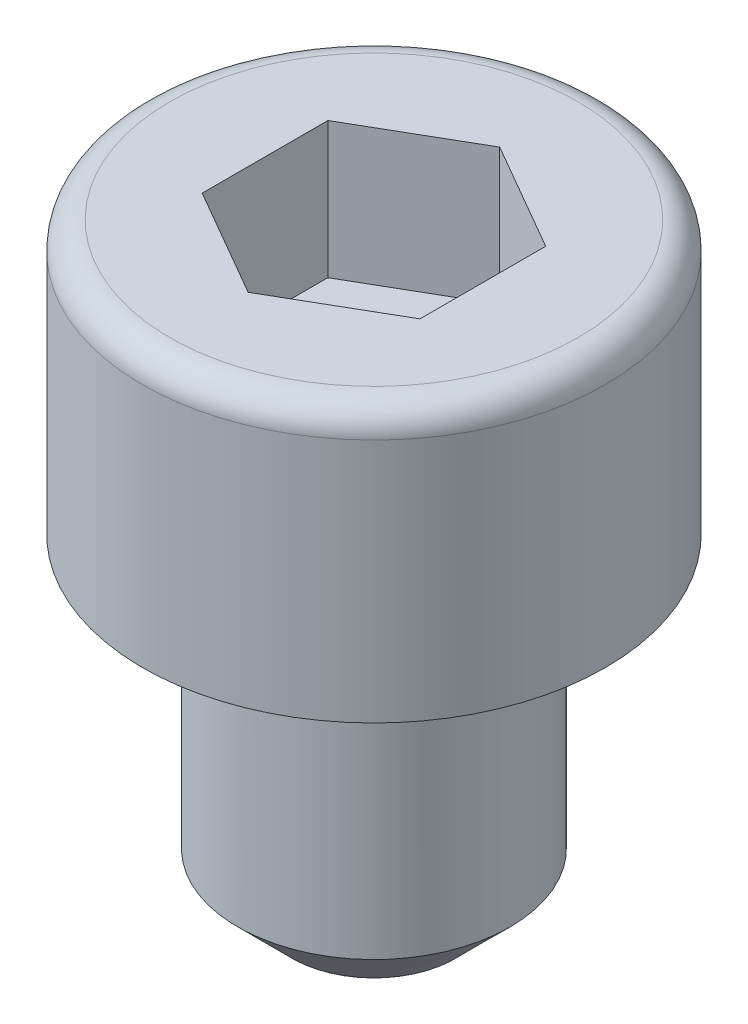
ISO-10303-21;
HEADER;
FILE_DESCRIPTION(('STEP AP214'),'2;1');
FILE_NAME('part.step','',(''),(''),'','','');
FILE_SCHEMA(('AUTOMOTIVE_DESIGN { 1 0 10303 214 1 1 1 1 }'));
ENDSEC;
DATA;
#1=APPLICATION_CONTEXT('core data for automotive mechanical design processes');
#2=APPLICATION_PROTOCOL_DEFINITION('international standard','automotive_design',2000,#1);
#3=PRODUCT_CONTEXT('',#1,'mechanical');
#4=PRODUCT('Part','Part','',(#3));
#5=PRODUCT_RELATED_PRODUCT_CATEGORY('part','',(#4));
#6=PRODUCT_DEFINITION_FORMATION('','',#4);
#7=PRODUCT_DEFINITION_CONTEXT('part definition',#1,'design');
#8=PRODUCT_DEFINITION('design','',#6,#7);
#9=PRODUCT_DEFINITION_SHAPE('','',#8);
#10=(LENGTH_UNIT() NAMED_UNIT(*) SI_UNIT(.MILLI.,.METRE.));
#11=(NAMED_UNIT(*) PLANE_ANGLE_UNIT() SI_UNIT($,.RADIAN.));
#12=(NAMED_UNIT(*) SI_UNIT($,.STERADIAN.) SOLID_ANGLE_UNIT());
#13=UNCERTAINTY_MEASURE_WITH_UNIT(LENGTH_MEASURE(1.E-05),#10,'distance_accuracy_value','');
#14=(GEOMETRIC_REPRESENTATION_CONTEXT(3) GLOBAL_UNCERTAINTY_ASSIGNED_CONTEXT((#13)) GLOBAL_UNIT_ASSIGNED_CONTEXT((#10,
#11,#12)) REPRESENTATION_CONTEXT('',''));
#15=CARTESIAN_POINT('',(0.,0.,0.));
#16=DIRECTION('',(0.,0.,1.));
#17=DIRECTION('',(1.,0.,0.));
#18=AXIS2_PLACEMENT_3D('',#15,#16,#17);
#19=CARTESIAN_POINT('',(-2.5,0.,0.));
#20=DIRECTION('',(0.,1.,0.));
#21=DIRECTION('',(-1.,0.,0.));
#22=AXIS2_PLACEMENT_3D('',#19,#20,#21);
#23=PLANE('',#22);
#24=CARTESIAN_POINT('',(0.,0.,0.));
#25=DIRECTION('',(0.,1.,0.));
#26=DIRECTION('',(-1.,0.,0.));
#27=AXIS2_PLACEMENT_3D('',#24,#25,#26);
#28=CIRCLE('',#27,1.49999999999992);
#29=CARTESIAN_POINT('',(-1.49999999999992,0.,0.));
#30=VERTEX_POINT('',#29);
#31=EDGE_CURVE('E42',#30,#30,#28,.F.);
#32=ORIENTED_EDGE('',*,*,#31,.T.);
#33=EDGE_LOOP('',(#32));
#34=FACE_BOUND('',#33,.T.);
#35=ADVANCED_FACE('F34',(#34),#23,.F.);
#36=CARTESIAN_POINT('',(0.,11.,0.));
#37=DIRECTION('',(0.,-1.,0.));
#38=DIRECTION('',(1.,0.,0.));
#39=AXIS2_PLACEMENT_3D('',#36,#37,#38);
#40=PLANE('',#39);
#41=CARTESIAN_POINT('',(0.,11.,0.));
#42=DIRECTION('',(0.,-1.,0.));
#43=DIRECTION('',(1.,0.,0.));
#44=AXIS2_PLACEMENT_3D('',#41,#42,#43);
#45=CIRCLE('',#44,3.74999999999997);
#46=CARTESIAN_POINT('',(3.74999999999993,11.,0.));
#47=VERTEX_POINT('',#46);
#48=EDGE_CURVE('E150',#47,#47,#45,.F.);
#49=ORIENTED_EDGE('',*,*,#48,.T.);
#50=EDGE_LOOP('',(#49));
#51=FACE_BOUND('',#50,.T.);
#52=DIRECTION('',(-0.866025403784439,0.,0.5));
#53=VECTOR('',#52,1.);
#54=CARTESIAN_POINT('',(0.,11.,-2.3094010767585));
#55=LINE('',#54,#53);
#56=CARTESIAN_POINT('',(0.,11.,-2.30940107675851));
#57=VERTEX_POINT('',#56);
#58=CARTESIAN_POINT('',(-2.00000000000004,11.,-1.15470053837925));
#59=VERTEX_POINT('',#58);
#60=EDGE_CURVE('E123',#57,#59,#55,.T.);
#61=ORIENTED_EDGE('',*,*,#60,.F.);
#62=DIRECTION('',(-0.866025403784439,0.,-0.5));
#63=VECTOR('',#62,1.);
#64=CARTESIAN_POINT('',(1.99999999999996,11.,-1.15470053837925));
#65=LINE('',#64,#63);
#66=CARTESIAN_POINT('',(1.99999999999996,11.,-1.15470053837925));
#67=VERTEX_POINT('',#66);
#68=EDGE_CURVE('E49',#67,#57,#65,.T.);
#69=ORIENTED_EDGE('',*,*,#68,.F.);
#70=DIRECTION('',(0.,0.,-1.));
#71=VECTOR('',#70,1.);
#72=CARTESIAN_POINT('',(1.99999999999996,11.,1.15470053837925));
#73=LINE('',#72,#71);
#74=CARTESIAN_POINT('',(1.99999999999996,11.,1.15470053837925));
#75=VERTEX_POINT('',#74);
#76=EDGE_CURVE('E132',#75,#67,#73,.T.);
#77=ORIENTED_EDGE('',*,*,#76,.F.);
#78=DIRECTION('',(0.866025403784439,0.,-0.5));
#79=VECTOR('',#78,1.);
#80=CARTESIAN_POINT('',(0.,11.,2.3094010767585));
#81=LINE('',#80,#79);
#82=CARTESIAN_POINT('',(0.,11.,2.3094010767585));
#83=VERTEX_POINT('',#82);
#84=EDGE_CURVE('E130',#83,#75,#81,.T.);
#85=ORIENTED_EDGE('',*,*,#84,.F.);
#86=DIRECTION('',(0.866025403784439,0.,0.5));
#87=VECTOR('',#86,1.);
#88=CARTESIAN_POINT('',(-2.00000000000004,11.,1.15470053837925));
#89=LINE('',#88,#87);
#90=CARTESIAN_POINT('',(-2.00000000000004,11.,1.15470053837925));
#91=VERTEX_POINT('',#90);
#92=EDGE_CURVE('E97',#91,#83,#89,.T.);
#93=ORIENTED_EDGE('',*,*,#92,.F.);
#94=DIRECTION('',(0.,0.,1.));
#95=VECTOR('',#94,1.);
#96=CARTESIAN_POINT('',(-2.00000000000004,11.,-1.15470053837925));
#97=LINE('',#96,#95);
#98=EDGE_CURVE('E126',#59,#91,#97,.T.);
#99=ORIENTED_EDGE('',*,*,#98,.F.);
#100=EDGE_LOOP('',(#61,#69,#77,#85,#93,#99));
#101=FACE_BOUND('',#100,.T.);
#102=ADVANCED_FACE('F165',(#51,#101),#40,.F.);
#103=CARTESIAN_POINT('',(3.49148133884313E-12,-1000.,0.));
#104=DIRECTION('',(0.,-1.,0.));
#105=DIRECTION('',(1.,0.,0.));
#106=AXIS2_PLACEMENT_3D('',#103,#104,#105);
#107=CYLINDRICAL_SURFACE('',#106,4.24999999999997);
#108=CARTESIAN_POINT('',(0.,10.5,0.));
#109=DIRECTION('',(0.,-1.,0.));
#110=DIRECTION('',(1.,0.,0.));
#111=AXIS2_PLACEMENT_3D('',#108,#109,#110);
#112=CIRCLE('',#111,4.24999999999997);
#113=CARTESIAN_POINT('',(4.24999999999993,10.5,0.));
#114=VERTEX_POINT('',#113);
#115=EDGE_CURVE('E147',#114,#114,#112,.T.);
#116=ORIENTED_EDGE('',*,*,#115,.T.);
#117=EDGE_LOOP('',(#116));
#118=FACE_BOUND('',#117,.T.);
#119=CARTESIAN_POINT('',(0.,6.00000000000001,0.));
#120=DIRECTION('',(0.,-1.,0.));
#121=DIRECTION('',(1.,0.,0.));
#122=AXIS2_PLACEMENT_3D('',#119,#120,#121);
#123=CIRCLE('',#122,4.24999999999998);
#124=CARTESIAN_POINT('',(4.24999999999996,6.00000000000002,0.));
#125=VERTEX_POINT('',#124);
#126=EDGE_CURVE('E144',#125,#125,#123,.T.);
#127=ORIENTED_EDGE('',*,*,#126,.F.);
#128=EDGE_LOOP('',(#127));
#129=FACE_BOUND('',#128,.T.);
#130=ADVANCED_FACE('F170',(#118,#129),#107,.T.);
#131=CARTESIAN_POINT('',(-4.25,6.,0.));
#132=DIRECTION('',(0.,1.,0.));
#133=DIRECTION('',(-1.,0.,0.));
#134=AXIS2_PLACEMENT_3D('',#131,#132,#133);
#135=PLANE('',#134);
#136=CARTESIAN_POINT('',(0.,6.00000000000001,0.));
#137=DIRECTION('',(0.,-1.,0.));
#138=DIRECTION('',(1.,0.,0.));
#139=AXIS2_PLACEMENT_3D('',#136,#137,#138);
#140=CIRCLE('',#139,2.49999999999998);
#141=CARTESIAN_POINT('',(2.49999999999996,6.00000000000001,0.));
#142=VERTEX_POINT('',#141);
#143=EDGE_CURVE('E136',#142,#142,#140,.T.);
#144=ORIENTED_EDGE('',*,*,#143,.F.);
#145=EDGE_LOOP('',(#144));
#146=FACE_BOUND('',#145,.T.);
#147=ORIENTED_EDGE('',*,*,#126,.T.);
#148=EDGE_LOOP('',(#147));
#149=FACE_BOUND('',#148,.T.);
#150=ADVANCED_FACE('F176',(#146,#149),#135,.F.);
#151=CARTESIAN_POINT('',(3.49148133884313E-12,-1000.,0.));
#152=DIRECTION('',(0.,-1.,0.));
#153=DIRECTION('',(1.,0.,0.));
#154=AXIS2_PLACEMENT_3D('',#151,#152,#153);
#155=CYLINDRICAL_SURFACE('',#154,2.49999999999999);
#156=CARTESIAN_POINT('',(0.,1.00000000000011,0.));
#157=DIRECTION('',(0.,1.,0.));
#158=DIRECTION('',(-1.,0.,0.));
#159=AXIS2_PLACEMENT_3D('',#156,#157,#158);
#160=CIRCLE('',#159,2.49999999999999);
#161=CARTESIAN_POINT('',(-2.49999999999999,1.0000000000001,0.));
#162=VERTEX_POINT('',#161);
#163=EDGE_CURVE('E11',#162,#162,#160,.T.);
#164=ORIENTED_EDGE('',*,*,#163,.T.);
#165=EDGE_LOOP('',(#164));
#166=FACE_BOUND('',#165,.T.);
#167=ORIENTED_EDGE('',*,*,#143,.T.);
#168=EDGE_LOOP('',(#167));
#169=FACE_BOUND('',#168,.T.);
#170=ADVANCED_FACE('F180',(#166,#169),#155,.T.);
#171=CARTESIAN_POINT('',(1.99999999999997,8.50000000000001,-1.15470053837925));
#172=DIRECTION('',(0.5,0.,-0.866025403784438));
#173=DIRECTION('',(-0.866025403784439,0.,-0.5));
#174=AXIS2_PLACEMENT_3D('',#171,#172,#173);
#175=PLANE('',#174);
#176=ORIENTED_EDGE('',*,*,#68,.T.);
#177=DIRECTION('',(0.,1.,0.));
#178=VECTOR('',#177,1.);
#179=CARTESIAN_POINT('',(0.,8.50000000000001,-2.3094010767585));
#180=LINE('',#179,#178);
#181=CARTESIAN_POINT('',(0.,8.50000000000001,-2.3094010767585));
#182=VERTEX_POINT('',#181);
#183=EDGE_CURVE('E79',#182,#57,#180,.T.);
#184=ORIENTED_EDGE('',*,*,#183,.F.);
#185=DIRECTION('',(-0.866025403784439,0.,-0.5));
#186=VECTOR('',#185,1.);
#187=CARTESIAN_POINT('',(1.99999999999997,8.50000000000001,-1.15470053837925));
#188=LINE('',#187,#186);
#189=CARTESIAN_POINT('',(1.99999999999997,8.50000000000001,-1.15470053837925));
#190=VERTEX_POINT('',#189);
#191=EDGE_CURVE('E134',#190,#182,#188,.T.);
#192=ORIENTED_EDGE('',*,*,#191,.F.);
#193=DIRECTION('',(0.,1.,0.));
#194=VECTOR('',#193,1.);
#195=CARTESIAN_POINT('',(1.99999999999997,8.50000000000001,-1.15470053837925));
#196=LINE('',#195,#194);
#197=EDGE_CURVE('E57',#190,#67,#196,.T.);
#198=ORIENTED_EDGE('',*,*,#197,.T.);
#199=EDGE_LOOP('',(#176,#184,#192,#198));
#200=FACE_BOUND('',#199,.T.);
#201=ADVANCED_FACE('F184',(#200),#175,.F.);
#202=CARTESIAN_POINT('',(1.99999999999997,8.50000000000001,1.15470053837925));
#203=DIRECTION('',(1.,0.,0.));
#204=DIRECTION('',(0.,1.,0.));
#205=AXIS2_PLACEMENT_3D('',#202,#203,#204);
#206=PLANE('',#205);
#207=ORIENTED_EDGE('',*,*,#76,.T.);
#208=ORIENTED_EDGE('',*,*,#197,.F.);
#209=DIRECTION('',(0.,0.,-1.));
#210=VECTOR('',#209,1.);
#211=CARTESIAN_POINT('',(1.99999999999997,8.50000000000001,1.15470053837925));
#212=LINE('',#211,#210);
#213=CARTESIAN_POINT('',(1.99999999999997,8.50000000000001,1.15470053837925));
#214=VERTEX_POINT('',#213);
#215=EDGE_CURVE('E109',#214,#190,#212,.T.);
#216=ORIENTED_EDGE('',*,*,#215,.F.);
#217=DIRECTION('',(0.,1.,0.));
#218=VECTOR('',#217,1.);
#219=CARTESIAN_POINT('',(1.99999999999997,8.50000000000001,1.15470053837925));
#220=LINE('',#219,#218);
#221=EDGE_CURVE('E101',#214,#75,#220,.T.);
#222=ORIENTED_EDGE('',*,*,#221,.T.);
#223=EDGE_LOOP('',(#207,#208,#216,#222));
#224=FACE_BOUND('',#223,.T.);
#225=ADVANCED_FACE('F188',(#224),#206,.F.);
#226=CARTESIAN_POINT('',(0.,8.50000000000001,2.3094010767585));
#227=DIRECTION('',(0.5,0.,0.866025403784439));
#228=DIRECTION('',(0.866025403784439,0.,-0.5));
#229=AXIS2_PLACEMENT_3D('',#226,#227,#228);
#230=PLANE('',#229);
#231=ORIENTED_EDGE('',*,*,#84,.T.);
#232=ORIENTED_EDGE('',*,*,#221,.F.);
#233=DIRECTION('',(0.866025403784439,0.,-0.5));
#234=VECTOR('',#233,1.);
#235=CARTESIAN_POINT('',(0.,8.50000000000001,2.3094010767585));
#236=LINE('',#235,#234);
#237=CARTESIAN_POINT('',(0.,8.50000000000001,2.3094010767585));
#238=VERTEX_POINT('',#237);
#239=EDGE_CURVE('E105',#238,#214,#236,.T.);
#240=ORIENTED_EDGE('',*,*,#239,.F.);
#241=DIRECTION('',(0.,1.,0.));
#242=VECTOR('',#241,1.);
#243=CARTESIAN_POINT('',(0.,8.50000000000001,2.3094010767585));
#244=LINE('',#243,#242);
#245=EDGE_CURVE('E90',#238,#83,#244,.T.);
#246=ORIENTED_EDGE('',*,*,#245,.T.);
#247=EDGE_LOOP('',(#231,#232,#240,#246));
#248=FACE_BOUND('',#247,.T.);
#249=ADVANCED_FACE('F106',(#248),#230,.F.);
#250=CARTESIAN_POINT('',(-2.00000000000003,8.5,1.15470053837925));
#251=DIRECTION('',(-0.5,0.,0.866025403784439));
#252=DIRECTION('',(0.866025403784439,0.,0.5));
#253=AXIS2_PLACEMENT_3D('',#250,#251,#252);
#254=PLANE('',#253);
#255=ORIENTED_EDGE('',*,*,#92,.T.);
#256=ORIENTED_EDGE('',*,*,#245,.F.);
#257=DIRECTION('',(0.866025403784439,0.,0.5));
#258=VECTOR('',#257,1.);
#259=CARTESIAN_POINT('',(-2.00000000000003,8.5,1.15470053837925));
#260=LINE('',#259,#258);
#261=CARTESIAN_POINT('',(-2.00000000000003,8.5,1.15470053837925));
#262=VERTEX_POINT('',#261);
#263=EDGE_CURVE('E94',#262,#238,#260,.T.);
#264=ORIENTED_EDGE('',*,*,#263,.F.);
#265=DIRECTION('',(0.,1.,0.));
#266=VECTOR('',#265,1.);
#267=CARTESIAN_POINT('',(-2.00000000000003,8.5,1.15470053837925));
#268=LINE('',#267,#266);
#269=EDGE_CURVE('E102',#262,#91,#268,.T.);
#270=ORIENTED_EDGE('',*,*,#269,.T.);
#271=EDGE_LOOP('',(#255,#256,#264,#270));
#272=FACE_BOUND('',#271,.T.);
#273=ADVANCED_FACE('F92',(#272),#254,.F.);
#274=CARTESIAN_POINT('',(-2.00000000000003,8.5,-1.15470053837925));
#275=DIRECTION('',(-1.,0.,0.));
#276=DIRECTION('',(0.,-1.,0.));
#277=AXIS2_PLACEMENT_3D('',#274,#275,#276);
#278=PLANE('',#277);
#279=ORIENTED_EDGE('',*,*,#98,.T.);
#280=ORIENTED_EDGE('',*,*,#269,.F.);
#281=DIRECTION('',(0.,0.,1.));
#282=VECTOR('',#281,1.);
#283=CARTESIAN_POINT('',(-2.00000000000003,8.5,-1.15470053837925));
#284=LINE('',#283,#282);
#285=CARTESIAN_POINT('',(-2.00000000000003,8.5,-1.15470053837925));
#286=VERTEX_POINT('',#285);
#287=EDGE_CURVE('E115',#286,#262,#284,.T.);
#288=ORIENTED_EDGE('',*,*,#287,.F.);
#289=DIRECTION('',(0.,1.,0.));
#290=VECTOR('',#289,1.);
#291=CARTESIAN_POINT('',(-2.00000000000003,8.5,-1.15470053837925));
#292=LINE('',#291,#290);
#293=EDGE_CURVE('E139',#286,#59,#292,.T.);
#294=ORIENTED_EDGE('',*,*,#293,.T.);
#295=EDGE_LOOP('',(#279,#280,#288,#294));
#296=FACE_BOUND('',#295,.T.);
#297=ADVANCED_FACE('F192',(#296),#278,.F.);
#298=CARTESIAN_POINT('',(0.,8.50000000000001,-2.3094010767585));
#299=DIRECTION('',(-0.5,0.,-0.866025403784439));
#300=DIRECTION('',(-0.866025403784439,0.,0.5));
#301=AXIS2_PLACEMENT_3D('',#298,#299,#300);
#302=PLANE('',#301);
#303=ORIENTED_EDGE('',*,*,#60,.T.);
#304=ORIENTED_EDGE('',*,*,#293,.F.);
#305=DIRECTION('',(-0.866025403784439,0.,0.5));
#306=VECTOR('',#305,1.);
#307=CARTESIAN_POINT('',(0.,8.50000000000001,-2.3094010767585));
#308=LINE('',#307,#306);
#309=EDGE_CURVE('E117',#182,#286,#308,.T.);
#310=ORIENTED_EDGE('',*,*,#309,.F.);
#311=ORIENTED_EDGE('',*,*,#183,.T.);
#312=EDGE_LOOP('',(#303,#304,#310,#311));
#313=FACE_BOUND('',#312,.T.);
#314=ADVANCED_FACE('F189',(#313),#302,.F.);
#315=CARTESIAN_POINT('',(0.,8.50000000000001,0.));
#316=DIRECTION('',(0.,1.,0.));
#317=DIRECTION('',(-1.,0.,0.));
#318=AXIS2_PLACEMENT_3D('',#315,#316,#317);
#319=PLANE('',#318);
#320=ORIENTED_EDGE('',*,*,#191,.T.);
#321=ORIENTED_EDGE('',*,*,#309,.T.);
#322=ORIENTED_EDGE('',*,*,#287,.T.);
#323=ORIENTED_EDGE('',*,*,#263,.T.);
#324=ORIENTED_EDGE('',*,*,#239,.T.);
#325=ORIENTED_EDGE('',*,*,#215,.T.);
#326=EDGE_LOOP('',(#320,#321,#322,#323,#324,#325));
#327=FACE_BOUND('',#326,.T.);
#328=ADVANCED_FACE('F112',(#327),#319,.T.);
#329=CARTESIAN_POINT('',(0.,10.5,0.));
#330=DIRECTION('',(0.,-1.,0.));
#331=DIRECTION('',(1.,0.,0.));
#332=AXIS2_PLACEMENT_3D('',#329,#330,#331);
#333=TOROIDAL_SURFACE('',#332,3.74999999999997,0.5);
#334=ORIENTED_EDGE('',*,*,#48,.F.);
#335=EDGE_LOOP('',(#334));
#336=FACE_BOUND('',#335,.T.);
#337=ORIENTED_EDGE('',*,*,#115,.F.);
#338=EDGE_LOOP('',(#337));
#339=FACE_BOUND('',#338,.T.);
#340=ADVANCED_FACE('F157',(#336,#339),#333,.T.);
#341=CARTESIAN_POINT('',(0.,0.,0.));
#342=DIRECTION('',(0.,1.,0.));
#343=DIRECTION('',(-1.,0.,0.));
#344=AXIS2_PLACEMENT_3D('',#341,#342,#343);
#345=CONICAL_SURFACE('',#344,1.49999999999992,0.785398163397428);
#346=ORIENTED_EDGE('',*,*,#163,.F.);
#347=EDGE_LOOP('',(#346));
#348=FACE_BOUND('',#347,.T.);
#349=ORIENTED_EDGE('',*,*,#31,.F.);
#350=EDGE_LOOP('',(#349));
#351=FACE_BOUND('',#350,.T.);
#352=ADVANCED_FACE('F36',(#348,#351),#345,.T.);
#353=CLOSED_SHELL('',(#35,#102,#130,#150,#170,#201,#225,#249,#273,#297,#314,#328,#340,#352));
#354=MANIFOLD_SOLID_BREP('B2',#353);
#355=ADVANCED_BREP_SHAPE_REPRESENTATION('',(#18,#354),#14);
#356=SHAPE_DEFINITION_REPRESENTATION(#9,#355);
ENDSEC;
END-ISO-10303-21;
